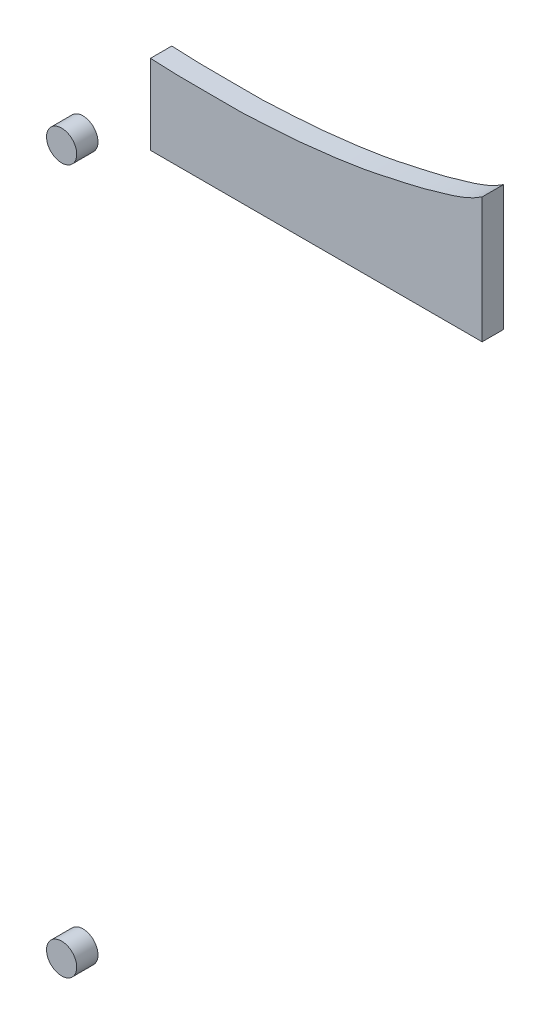
ISO-10303-21;
HEADER;
FILE_DESCRIPTION(('STEP AP214'),'2;1');
FILE_NAME('part.step','',(''),(''),'','','');
FILE_SCHEMA(('AUTOMOTIVE_DESIGN { 1 0 10303 214 1 1 1 1 }'));
ENDSEC;
DATA;
#1=APPLICATION_CONTEXT('core data for automotive mechanical design processes');
#2=APPLICATION_PROTOCOL_DEFINITION('international standard','automotive_design',2000,#1);
#3=PRODUCT_CONTEXT('',#1,'mechanical');
#4=PRODUCT('Part','Part','',(#3));
#5=PRODUCT_RELATED_PRODUCT_CATEGORY('part','',(#4));
#6=PRODUCT_DEFINITION_FORMATION('','',#4);
#7=PRODUCT_DEFINITION_CONTEXT('part definition',#1,'design');
#8=PRODUCT_DEFINITION('design','',#6,#7);
#9=PRODUCT_DEFINITION_SHAPE('','',#8);
#10=(LENGTH_UNIT() NAMED_UNIT(*) SI_UNIT(.MILLI.,.METRE.));
#11=(NAMED_UNIT(*) PLANE_ANGLE_UNIT() SI_UNIT($,.RADIAN.));
#12=(NAMED_UNIT(*) SI_UNIT($,.STERADIAN.) SOLID_ANGLE_UNIT());
#13=UNCERTAINTY_MEASURE_WITH_UNIT(LENGTH_MEASURE(1.E-05),#10,'distance_accuracy_value','');
#14=(GEOMETRIC_REPRESENTATION_CONTEXT(3) GLOBAL_UNCERTAINTY_ASSIGNED_CONTEXT((#13)) GLOBAL_UNIT_ASSIGNED_CONTEXT((#10,
#11,#12)) REPRESENTATION_CONTEXT('',''));
#15=CARTESIAN_POINT('',(0.,0.,0.));
#16=DIRECTION('',(0.,0.,1.));
#17=DIRECTION('',(1.,0.,0.));
#18=AXIS2_PLACEMENT_3D('',#15,#16,#17);
#19=CARTESIAN_POINT('',(-414.787312152864,141.459761952969,3.17499999999998));
#20=DIRECTION('',(0.,0.,-1.));
#21=DIRECTION('',(0.,1.,0.));
#22=AXIS2_PLACEMENT_3D('',#19,#20,#21);
#23=PLANE('',#22);
#24=DIRECTION('',(0.,-1.,0.));
#25=VECTOR('',#24,1.);
#26=CARTESIAN_POINT('',(-414.787312152864,141.459761952969,3.17499999999998));
#27=LINE('',#26,#25);
#28=CARTESIAN_POINT('',(-414.787312152864,137.220888890738,3.17499999999999));
#29=VERTEX_POINT('',#28);
#30=CARTESIAN_POINT('',(-414.787312152864,118.5,3.17499999999999));
#31=VERTEX_POINT('',#30);
#32=EDGE_CURVE('E113',#29,#31,#27,.T.);
#33=ORIENTED_EDGE('',*,*,#32,.F.);
#34=CARTESIAN_POINT('',(-414.787312152864,137.220888890738,3.17499999999998));
#35=CARTESIAN_POINT('',(-416.803355128461,135.839883740091,3.17499999999998));
#36=CARTESIAN_POINT('',(-420.148230363348,134.896102648278,3.17499999999998));
#37=CARTESIAN_POINT('',(-424.514399840596,133.641199566259,3.17499999999998));
#38=CARTESIAN_POINT('',(-427.753187268442,132.983461779194,3.17499999999998));
#39=CARTESIAN_POINT('',(-431.906399587009,132.015072767501,3.17499999999998));
#40=CARTESIAN_POINT('',(-436.775926000698,131.291578004717,3.17499999999998));
#41=CARTESIAN_POINT('',(-441.46937671741,130.759923399542,3.17499999999998));
#42=CARTESIAN_POINT('',(-445.244870821872,130.459970277163,3.17499999999998));
#43=CARTESIAN_POINT('',(-448.120397534455,130.350176556061,3.17499999999998));
#44=CARTESIAN_POINT('',(-450.46841600858,130.168574826604,3.17499999999998));
#45=CARTESIAN_POINT('',(-452.276227088119,130.20055929367,3.17499999999998));
#46=CARTESIAN_POINT('',(-453.625826875851,130.185456971471,3.17499999999998));
#47=CARTESIAN_POINT('',(-455.285756929959,130.205272664669,3.17499999999998));
#48=CARTESIAN_POINT('',(-456.826171615218,130.205525979654,3.17499999999998));
#49=CARTESIAN_POINT('',(-458.293104177272,130.2050536917,3.17499999999998));
#50=CARTESIAN_POINT('',(-468.738502059534,130.26969835517,3.17499999999998));
#51=CARTESIAN_POINT('',(-478.824094069324,131.83126087228,3.17499999999998));
#52=CARTESIAN_POINT('',(-488.015089832885,135.328425641433,3.17499999999998));
#53=B_SPLINE_CURVE_WITH_KNOTS('',3,(#34,#35,#36,#37,#38,#39,#40,#41,#42,#43,#44,#45,#46,#47,#48,
#49,#50,#51,#52),.UNSPECIFIED.,.F.,.F.,(4,1,1,1,1,1,1,1,1,1,1,1,1,1,1,1,4),(0.,
0.0972597935024035,0.137717888168622,0.182659819387801,0.229817850426529,0.308935289153821,
0.380085487174853,0.419482255060533,0.460955677625635,0.495635111406558,0.51394135121419,
0.533517447004437,0.549827506604969,0.580590235286589,0.595366858204064,0.608725716952993,1.),.UNSPECIFIED.);
#54=CARTESIAN_POINT('',(-464.25,130.389934861826,3.17499999999998));
#55=VERTEX_POINT('',#54);
#56=EDGE_CURVE('E118',#29,#55,#53,.T.);
#57=ORIENTED_EDGE('',*,*,#56,.T.);
#58=DIRECTION('',(0.,-1.,0.));
#59=VECTOR('',#58,1.);
#60=CARTESIAN_POINT('',(-464.25,141.459761952969,3.17499999999998));
#61=LINE('',#60,#59);
#62=CARTESIAN_POINT('',(-464.25,118.5,3.17499999999999));
#63=VERTEX_POINT('',#62);
#64=EDGE_CURVE('E105',#55,#63,#61,.T.);
#65=ORIENTED_EDGE('',*,*,#64,.T.);
#66=DIRECTION('',(-1.,0.,0.));
#67=VECTOR('',#66,1.);
#68=CARTESIAN_POINT('',(-414.787312152864,118.5,3.17499999999999));
#69=LINE('',#68,#67);
#70=EDGE_CURVE('E67',#31,#63,#69,.T.);
#71=ORIENTED_EDGE('',*,*,#70,.F.);
#72=EDGE_LOOP('',(#33,#57,#65,#71));
#73=FACE_BOUND('',#72,.T.);
#74=ADVANCED_FACE('F60',(#73),#23,.F.);
#75=CARTESIAN_POINT('',(-414.787312152864,118.5,3.17499999999999));
#76=DIRECTION('',(0.,1.,0.));
#77=DIRECTION('',(-1.,0.,0.));
#78=AXIS2_PLACEMENT_3D('',#75,#76,#77);
#79=PLANE('',#78);
#80=DIRECTION('',(0.,0.,-1.));
#81=VECTOR('',#80,1.);
#82=CARTESIAN_POINT('',(-464.25,118.5,3.17499999999999));
#83=LINE('',#82,#81);
#84=CARTESIAN_POINT('',(-464.25,118.5,0.));
#85=VERTEX_POINT('',#84);
#86=EDGE_CURVE('E95',#63,#85,#83,.T.);
#87=ORIENTED_EDGE('',*,*,#86,.T.);
#88=DIRECTION('',(-1.,0.,0.));
#89=VECTOR('',#88,1.);
#90=CARTESIAN_POINT('',(-414.787312152864,118.5,0.));
#91=LINE('',#90,#89);
#92=CARTESIAN_POINT('',(-414.787312152864,118.5,0.));
#93=VERTEX_POINT('',#92);
#94=EDGE_CURVE('E98',#93,#85,#91,.T.);
#95=ORIENTED_EDGE('',*,*,#94,.F.);
#96=DIRECTION('',(0.,0.,-1.));
#97=VECTOR('',#96,1.);
#98=CARTESIAN_POINT('',(-414.787312152864,118.5,3.17499999999999));
#99=LINE('',#98,#97);
#100=EDGE_CURVE('E82',#31,#93,#99,.T.);
#101=ORIENTED_EDGE('',*,*,#100,.F.);
#102=ORIENTED_EDGE('',*,*,#70,.T.);
#103=EDGE_LOOP('',(#87,#95,#101,#102));
#104=FACE_BOUND('',#103,.T.);
#105=ADVANCED_FACE('F97',(#104),#79,.F.);
#106=CARTESIAN_POINT('',(-414.787312152864,118.5,0.));
#107=DIRECTION('',(0.,0.,1.));
#108=DIRECTION('',(0.,-1.,0.));
#109=AXIS2_PLACEMENT_3D('',#106,#107,#108);
#110=PLANE('',#109);
#111=DIRECTION('',(0.,1.,0.));
#112=VECTOR('',#111,1.);
#113=CARTESIAN_POINT('',(-464.25,118.5,0.));
#114=LINE('',#113,#112);
#115=CARTESIAN_POINT('',(-464.25,130.389934862193,0.));
#116=VERTEX_POINT('',#115);
#117=EDGE_CURVE('E104',#85,#116,#114,.T.);
#118=ORIENTED_EDGE('',*,*,#117,.T.);
#119=CARTESIAN_POINT('',(-414.787312152864,137.220888890738,0.));
#120=CARTESIAN_POINT('',(-416.803355128461,135.839883740091,0.));
#121=CARTESIAN_POINT('',(-420.148230363348,134.896102648278,0.));
#122=CARTESIAN_POINT('',(-424.514399840596,133.641199566259,0.));
#123=CARTESIAN_POINT('',(-427.753187268442,132.983461779194,0.));
#124=CARTESIAN_POINT('',(-431.906399587009,132.015072767501,0.));
#125=CARTESIAN_POINT('',(-436.775926000698,131.291578004717,0.));
#126=CARTESIAN_POINT('',(-441.46937671741,130.759923399542,0.));
#127=CARTESIAN_POINT('',(-445.244870821872,130.459970277163,0.));
#128=CARTESIAN_POINT('',(-448.120397534455,130.350176556061,0.));
#129=CARTESIAN_POINT('',(-450.46841600858,130.168574826604,0.));
#130=CARTESIAN_POINT('',(-452.276227088119,130.20055929367,0.));
#131=CARTESIAN_POINT('',(-453.625826875851,130.185456971471,0.));
#132=CARTESIAN_POINT('',(-455.285756929959,130.205272664669,0.));
#133=CARTESIAN_POINT('',(-456.826171615218,130.205525979654,0.));
#134=CARTESIAN_POINT('',(-458.293104177272,130.2050536917,0.));
#135=CARTESIAN_POINT('',(-468.738502059534,130.26969835517,0.));
#136=CARTESIAN_POINT('',(-478.824094069324,131.83126087228,0.));
#137=CARTESIAN_POINT('',(-488.015089832885,135.328425641433,0.));
#138=B_SPLINE_CURVE_WITH_KNOTS('',3,(#119,#120,#121,#122,#123,#124,#125,#126,#127,#128,#129,
#130,#131,#132,#133,#134,#135,#136,#137),.UNSPECIFIED.,.F.,.F.,(4,1,1,1,1,1,1,1,1,1,1,1,1,1,1,1,
4),(0.,0.0972597935024035,0.137717888168622,0.182659819387801,0.229817850426529,
0.308935289153821,0.380085487174853,0.419482255060533,0.460955677625635,0.495635111406558,
0.51394135121419,0.533517447004437,0.549827506604969,0.580590235286589,0.595366858204064,
0.608725716952993,1.),.UNSPECIFIED.);
#139=CARTESIAN_POINT('',(-414.787312152864,137.220888890738,0.));
#140=VERTEX_POINT('',#139);
#141=EDGE_CURVE('E74',#140,#116,#138,.T.);
#142=ORIENTED_EDGE('',*,*,#141,.F.);
#143=DIRECTION('',(0.,1.,0.));
#144=VECTOR('',#143,1.);
#145=CARTESIAN_POINT('',(-414.787312152864,118.5,0.));
#146=LINE('',#145,#144);
#147=EDGE_CURVE('E110',#93,#140,#146,.T.);
#148=ORIENTED_EDGE('',*,*,#147,.F.);
#149=ORIENTED_EDGE('',*,*,#94,.T.);
#150=EDGE_LOOP('',(#118,#142,#148,#149));
#151=FACE_BOUND('',#150,.T.);
#152=ADVANCED_FACE('F109',(#151),#110,.F.);
#153=CARTESIAN_POINT('',(-414.787312152864,0.,0.));
#154=DIRECTION('',(1.,0.,0.));
#155=DIRECTION('',(0.,0.,-1.));
#156=AXIS2_PLACEMENT_3D('',#153,#154,#155);
#157=PLANE('',#156);
#158=DIRECTION('',(0.,0.,-1.));
#159=VECTOR('',#158,1.);
#160=CARTESIAN_POINT('',(-414.787312152864,137.220888890738,5.08));
#161=LINE('',#160,#159);
#162=EDGE_CURVE('E125',#29,#140,#161,.T.);
#163=ORIENTED_EDGE('',*,*,#162,.F.);
#164=ORIENTED_EDGE('',*,*,#32,.T.);
#165=ORIENTED_EDGE('',*,*,#100,.T.);
#166=ORIENTED_EDGE('',*,*,#147,.T.);
#167=EDGE_LOOP('',(#163,#164,#165,#166));
#168=FACE_BOUND('',#167,.T.);
#169=ADVANCED_FACE('F146',(#168),#157,.T.);
#170=CARTESIAN_POINT('',(-464.25,0.,0.));
#171=DIRECTION('',(1.,0.,0.));
#172=DIRECTION('',(0.,0.,-1.));
#173=AXIS2_PLACEMENT_3D('',#170,#171,#172);
#174=PLANE('',#173);
#175=ORIENTED_EDGE('',*,*,#64,.F.);
#176=DIRECTION('',(0.,0.,-1.));
#177=VECTOR('',#176,1.);
#178=CARTESIAN_POINT('',(-464.25,130.389934861826,5.08));
#179=LINE('',#178,#177);
#180=EDGE_CURVE('E13',#55,#116,#179,.T.);
#181=ORIENTED_EDGE('',*,*,#180,.T.);
#182=ORIENTED_EDGE('',*,*,#117,.F.);
#183=ORIENTED_EDGE('',*,*,#86,.F.);
#184=EDGE_LOOP('',(#175,#181,#182,#183));
#185=FACE_BOUND('',#184,.T.);
#186=ADVANCED_FACE('F112',(#185),#174,.F.);
#187=CARTESIAN_POINT('',(-414.787312152864,137.220888890738,5.08));
#188=CARTESIAN_POINT('',(-416.803355128461,135.839883740091,5.08));
#189=CARTESIAN_POINT('',(-420.148230363348,134.896102648278,5.08));
#190=CARTESIAN_POINT('',(-424.514399840596,133.641199566259,5.08));
#191=CARTESIAN_POINT('',(-427.753187268442,132.983461779194,5.08));
#192=CARTESIAN_POINT('',(-431.906399587009,132.015072767501,5.08));
#193=CARTESIAN_POINT('',(-436.775926000698,131.291578004717,5.08));
#194=CARTESIAN_POINT('',(-441.46937671741,130.759923399542,5.08));
#195=CARTESIAN_POINT('',(-445.244870821872,130.459970277163,5.08));
#196=CARTESIAN_POINT('',(-448.120397534455,130.350176556061,5.08));
#197=CARTESIAN_POINT('',(-450.46841600858,130.168574826604,5.08));
#198=CARTESIAN_POINT('',(-452.276227088119,130.20055929367,5.08));
#199=CARTESIAN_POINT('',(-453.625826875851,130.185456971471,5.08));
#200=CARTESIAN_POINT('',(-455.285756929959,130.205272664669,5.08));
#201=CARTESIAN_POINT('',(-456.826171615218,130.205525979654,5.08));
#202=CARTESIAN_POINT('',(-458.293104177272,130.2050536917,5.08));
#203=CARTESIAN_POINT('',(-468.738502059534,130.26969835517,5.08));
#204=CARTESIAN_POINT('',(-478.824094069324,131.83126087228,5.08));
#205=CARTESIAN_POINT('',(-488.015089832885,135.328425641433,5.08));
#206=B_SPLINE_CURVE_WITH_KNOTS('',3,(#187,#188,#189,#190,#191,#192,#193,#194,#195,#196,#197,
#198,#199,#200,#201,#202,#203,#204,#205),.UNSPECIFIED.,.F.,.F.,(4,1,1,1,1,1,1,1,1,1,1,1,1,1,1,1,
4),(0.,0.0972597935024035,0.137717888168622,0.182659819387801,0.229817850426529,
0.308935289153821,0.380085487174853,0.419482255060533,0.460955677625635,0.495635111406558,
0.51394135121419,0.533517447004437,0.549827506604969,0.580590235286589,0.595366858204064,
0.608725716952993,1.),.UNSPECIFIED.);
#207=DIRECTION('',(0.,0.,-1.));
#208=VECTOR('',#207,1.);
#209=SURFACE_OF_LINEAR_EXTRUSION('',#206,#208);
#210=ORIENTED_EDGE('',*,*,#162,.T.);
#211=ORIENTED_EDGE('',*,*,#141,.T.);
#212=ORIENTED_EDGE('',*,*,#180,.F.);
#213=ORIENTED_EDGE('',*,*,#56,.F.);
#214=EDGE_LOOP('',(#210,#211,#212,#213));
#215=FACE_BOUND('',#214,.T.);
#216=ADVANCED_FACE('F143',(#215),#209,.F.);
#217=CLOSED_SHELL('',(#74,#105,#152,#169,#186,#216));
#218=MANIFOLD_SOLID_BREP('B2',#217);
#219=CARTESIAN_POINT('',(0.,0.,0.));
#220=DIRECTION('',(0.,0.,1.));
#221=DIRECTION('',(1.,0.,0.));
#222=AXIS2_PLACEMENT_3D('',#219,#220,#221);
#223=PLANE('',#222);
#224=CARTESIAN_POINT('',(-477.5,7.49999999999986,0.));
#225=DIRECTION('',(0.,0.,1.));
#226=DIRECTION('',(1.,0.,0.));
#227=AXIS2_PLACEMENT_3D('',#224,#225,#226);
#228=CIRCLE('',#227,2.24999999999995);
#229=CARTESIAN_POINT('',(-475.25,7.49999999999986,0.));
#230=VERTEX_POINT('',#229);
#231=EDGE_CURVE('E214',#230,#230,#228,.T.);
#232=ORIENTED_EDGE('',*,*,#231,.F.);
#233=EDGE_LOOP('',(#232));
#234=FACE_BOUND('',#233,.T.);
#235=ADVANCED_FACE('F208',(#234),#223,.F.);
#236=CARTESIAN_POINT('',(0.,0.,3.175));
#237=DIRECTION('',(0.,0.,1.));
#238=DIRECTION('',(1.,0.,0.));
#239=AXIS2_PLACEMENT_3D('',#236,#237,#238);
#240=PLANE('',#239);
#241=CARTESIAN_POINT('',(-477.5,7.49999999999986,3.175));
#242=DIRECTION('',(0.,0.,1.));
#243=DIRECTION('',(1.,0.,0.));
#244=AXIS2_PLACEMENT_3D('',#241,#242,#243);
#245=CIRCLE('',#244,2.24999999999995);
#246=CARTESIAN_POINT('',(-475.25,7.49999999999986,3.175));
#247=VERTEX_POINT('',#246);
#248=EDGE_CURVE('E59',#247,#247,#245,.T.);
#249=ORIENTED_EDGE('',*,*,#248,.T.);
#250=EDGE_LOOP('',(#249));
#251=FACE_BOUND('',#250,.T.);
#252=ADVANCED_FACE('F224',(#251),#240,.T.);
#253=CARTESIAN_POINT('',(-477.5,7.49999999999986,0.));
#254=DIRECTION('',(0.,0.,1.));
#255=DIRECTION('',(1.,0.,0.));
#256=AXIS2_PLACEMENT_3D('',#253,#254,#255);
#257=CYLINDRICAL_SURFACE('',#256,2.24999999999995);
#258=ORIENTED_EDGE('',*,*,#231,.T.);
#259=EDGE_LOOP('',(#258));
#260=FACE_BOUND('',#259,.T.);
#261=ORIENTED_EDGE('',*,*,#248,.F.);
#262=EDGE_LOOP('',(#261));
#263=FACE_BOUND('',#262,.T.);
#264=ADVANCED_FACE('F220',(#260,#263),#257,.T.);
#265=CLOSED_SHELL('',(#235,#252,#264));
#266=MANIFOLD_SOLID_BREP('B7',#265);
#267=CARTESIAN_POINT('',(0.,0.,0.));
#268=DIRECTION('',(0.,0.,1.));
#269=DIRECTION('',(1.,0.,0.));
#270=AXIS2_PLACEMENT_3D('',#267,#268,#269);
#271=PLANE('',#270);
#272=CARTESIAN_POINT('',(-477.5,112.5,0.));
#273=DIRECTION('',(0.,0.,1.));
#274=DIRECTION('',(1.,0.,0.));
#275=AXIS2_PLACEMENT_3D('',#272,#273,#274);
#276=CIRCLE('',#275,2.24999999999995);
#277=CARTESIAN_POINT('',(-475.25,112.5,0.));
#278=VERTEX_POINT('',#277);
#279=EDGE_CURVE('E255',#278,#278,#276,.T.);
#280=ORIENTED_EDGE('',*,*,#279,.F.);
#281=EDGE_LOOP('',(#280));
#282=FACE_BOUND('',#281,.T.);
#283=ADVANCED_FACE('F249',(#282),#271,.F.);
#284=CARTESIAN_POINT('',(0.,0.,3.175));
#285=DIRECTION('',(0.,0.,1.));
#286=DIRECTION('',(1.,0.,0.));
#287=AXIS2_PLACEMENT_3D('',#284,#285,#286);
#288=PLANE('',#287);
#289=CARTESIAN_POINT('',(-477.5,112.5,3.175));
#290=DIRECTION('',(0.,0.,1.));
#291=DIRECTION('',(1.,0.,0.));
#292=AXIS2_PLACEMENT_3D('',#289,#290,#291);
#293=CIRCLE('',#292,2.24999999999995);
#294=CARTESIAN_POINT('',(-475.25,112.5,3.175));
#295=VERTEX_POINT('',#294);
#296=EDGE_CURVE('E207',#295,#295,#293,.T.);
#297=ORIENTED_EDGE('',*,*,#296,.T.);
#298=EDGE_LOOP('',(#297));
#299=FACE_BOUND('',#298,.T.);
#300=ADVANCED_FACE('F265',(#299),#288,.T.);
#301=CARTESIAN_POINT('',(-477.5,112.5,0.));
#302=DIRECTION('',(0.,0.,1.));
#303=DIRECTION('',(1.,0.,0.));
#304=AXIS2_PLACEMENT_3D('',#301,#302,#303);
#305=CYLINDRICAL_SURFACE('',#304,2.24999999999995);
#306=ORIENTED_EDGE('',*,*,#279,.T.);
#307=EDGE_LOOP('',(#306));
#308=FACE_BOUND('',#307,.T.);
#309=ORIENTED_EDGE('',*,*,#296,.F.);
#310=EDGE_LOOP('',(#309));
#311=FACE_BOUND('',#310,.T.);
#312=ADVANCED_FACE('F261',(#308,#311),#305,.T.);
#313=CLOSED_SHELL('',(#283,#300,#312));
#314=MANIFOLD_SOLID_BREP('B54',#313);
#315=ADVANCED_BREP_SHAPE_REPRESENTATION('',(#18,#218,#266,#314),#14);
#316=SHAPE_DEFINITION_REPRESENTATION(#9,#315);
ENDSEC;
END-ISO-10303-21;
